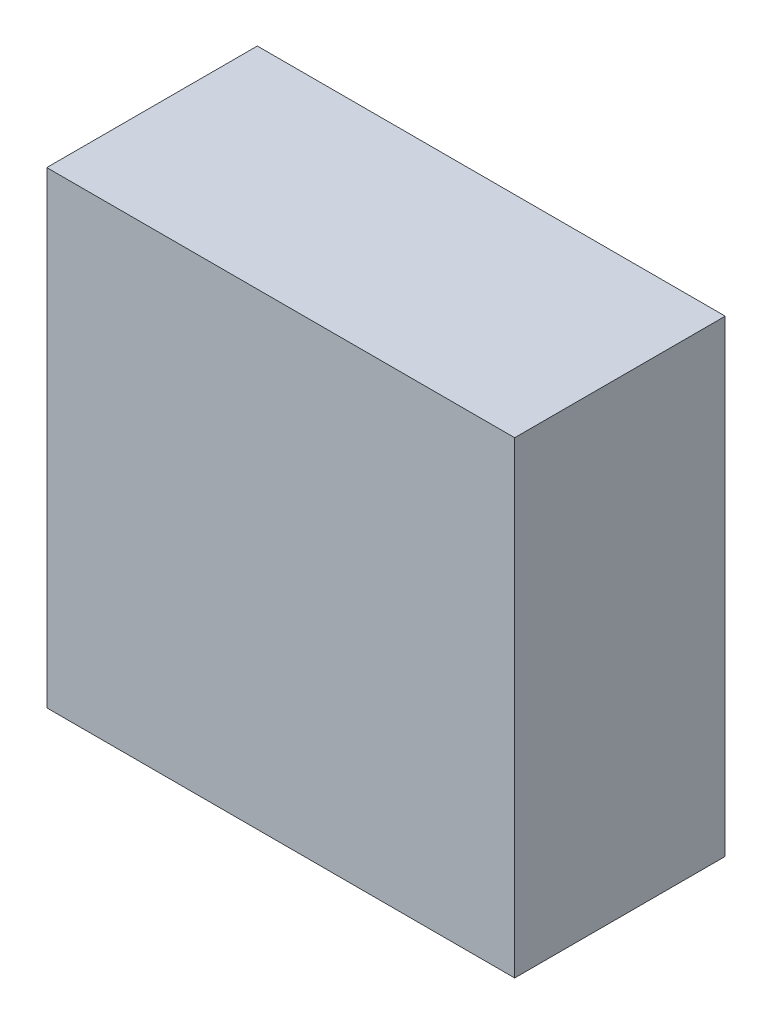
ISO-10303-21;
HEADER;
FILE_DESCRIPTION(('STEP AP214'),'2;1');
FILE_NAME('part.step','',(''),(''),'','','');
FILE_SCHEMA(('AUTOMOTIVE_DESIGN { 1 0 10303 214 1 1 1 1 }'));
ENDSEC;
DATA;
#1=APPLICATION_CONTEXT('core data for automotive mechanical design processes');
#2=APPLICATION_PROTOCOL_DEFINITION('international standard','automotive_design',2000,#1);
#3=PRODUCT_CONTEXT('',#1,'mechanical');
#4=PRODUCT('Part','Part','',(#3));
#5=PRODUCT_RELATED_PRODUCT_CATEGORY('part','',(#4));
#6=PRODUCT_DEFINITION_FORMATION('','',#4);
#7=PRODUCT_DEFINITION_CONTEXT('part definition',#1,'design');
#8=PRODUCT_DEFINITION('design','',#6,#7);
#9=PRODUCT_DEFINITION_SHAPE('','',#8);
#10=(LENGTH_UNIT() NAMED_UNIT(*) SI_UNIT(.MILLI.,.METRE.));
#11=(NAMED_UNIT(*) PLANE_ANGLE_UNIT() SI_UNIT($,.RADIAN.));
#12=(NAMED_UNIT(*) SI_UNIT($,.STERADIAN.) SOLID_ANGLE_UNIT());
#13=UNCERTAINTY_MEASURE_WITH_UNIT(LENGTH_MEASURE(1.E-05),#10,'distance_accuracy_value','');
#14=(GEOMETRIC_REPRESENTATION_CONTEXT(3) GLOBAL_UNCERTAINTY_ASSIGNED_CONTEXT((#13)) GLOBAL_UNIT_ASSIGNED_CONTEXT((#10,
#11,#12)) REPRESENTATION_CONTEXT('',''));
#15=CARTESIAN_POINT('',(0.,0.,0.));
#16=DIRECTION('',(0.,0.,1.));
#17=DIRECTION('',(1.,0.,0.));
#18=AXIS2_PLACEMENT_3D('',#15,#16,#17);
#19=CARTESIAN_POINT('',(-5.,5.,0.));
#20=DIRECTION('',(0.,1.,0.));
#21=DIRECTION('',(1.,0.,0.));
#22=AXIS2_PLACEMENT_3D('',#19,#20,#21);
#23=PLANE('',#22);
#24=DIRECTION('',(0.,0.,1.));
#25=VECTOR('',#24,1.);
#26=CARTESIAN_POINT('',(-5.,5.,0.));
#27=LINE('',#26,#25);
#28=CARTESIAN_POINT('',(-5.,5.,0.));
#29=VERTEX_POINT('',#28);
#30=CARTESIAN_POINT('',(-5.,5.,4.5));
#31=VERTEX_POINT('',#30);
#32=EDGE_CURVE('E11',#29,#31,#27,.T.);
#33=ORIENTED_EDGE('',*,*,#32,.T.);
#34=DIRECTION('',(1.,0.,0.));
#35=VECTOR('',#34,1.);
#36=CARTESIAN_POINT('',(-5.,5.,4.5));
#37=LINE('',#36,#35);
#38=CARTESIAN_POINT('',(5.,5.,4.5));
#39=VERTEX_POINT('',#38);
#40=EDGE_CURVE('E23',#31,#39,#37,.T.);
#41=ORIENTED_EDGE('',*,*,#40,.T.);
#42=DIRECTION('',(0.,0.,1.));
#43=VECTOR('',#42,1.);
#44=CARTESIAN_POINT('',(5.,5.,0.));
#45=LINE('',#44,#43);
#46=CARTESIAN_POINT('',(5.,5.,0.));
#47=VERTEX_POINT('',#46);
#48=EDGE_CURVE('E84',#47,#39,#45,.T.);
#49=ORIENTED_EDGE('',*,*,#48,.F.);
#50=DIRECTION('',(1.,0.,0.));
#51=VECTOR('',#50,1.);
#52=CARTESIAN_POINT('',(-5.,5.,0.));
#53=LINE('',#52,#51);
#54=EDGE_CURVE('E82',#29,#47,#53,.T.);
#55=ORIENTED_EDGE('',*,*,#54,.F.);
#56=EDGE_LOOP('',(#33,#41,#49,#55));
#57=FACE_BOUND('',#56,.T.);
#58=ADVANCED_FACE('F16',(#57),#23,.T.);
#59=CARTESIAN_POINT('',(5.,5.,0.));
#60=DIRECTION('',(1.,0.,0.));
#61=DIRECTION('',(0.,-1.,0.));
#62=AXIS2_PLACEMENT_3D('',#59,#60,#61);
#63=PLANE('',#62);
#64=ORIENTED_EDGE('',*,*,#48,.T.);
#65=DIRECTION('',(0.,-1.,0.));
#66=VECTOR('',#65,1.);
#67=CARTESIAN_POINT('',(5.,5.,4.5));
#68=LINE('',#67,#66);
#69=CARTESIAN_POINT('',(5.,-5.,4.5));
#70=VERTEX_POINT('',#69);
#71=EDGE_CURVE('E80',#39,#70,#68,.T.);
#72=ORIENTED_EDGE('',*,*,#71,.T.);
#73=DIRECTION('',(0.,0.,1.));
#74=VECTOR('',#73,1.);
#75=CARTESIAN_POINT('',(5.,-5.,0.));
#76=LINE('',#75,#74);
#77=CARTESIAN_POINT('',(5.,-5.,0.));
#78=VERTEX_POINT('',#77);
#79=EDGE_CURVE('E78',#78,#70,#76,.T.);
#80=ORIENTED_EDGE('',*,*,#79,.F.);
#81=DIRECTION('',(0.,-1.,0.));
#82=VECTOR('',#81,1.);
#83=CARTESIAN_POINT('',(5.,5.,0.));
#84=LINE('',#83,#82);
#85=EDGE_CURVE('E69',#47,#78,#84,.T.);
#86=ORIENTED_EDGE('',*,*,#85,.F.);
#87=EDGE_LOOP('',(#64,#72,#80,#86));
#88=FACE_BOUND('',#87,.T.);
#89=ADVANCED_FACE('F89',(#88),#63,.T.);
#90=CARTESIAN_POINT('',(5.,-5.,0.));
#91=DIRECTION('',(0.,-1.,0.));
#92=DIRECTION('',(-1.,0.,0.));
#93=AXIS2_PLACEMENT_3D('',#90,#91,#92);
#94=PLANE('',#93);
#95=ORIENTED_EDGE('',*,*,#79,.T.);
#96=DIRECTION('',(-1.,0.,0.));
#97=VECTOR('',#96,1.);
#98=CARTESIAN_POINT('',(5.,-5.,4.5));
#99=LINE('',#98,#97);
#100=CARTESIAN_POINT('',(-5.,-5.,4.5));
#101=VERTEX_POINT('',#100);
#102=EDGE_CURVE('E59',#70,#101,#99,.T.);
#103=ORIENTED_EDGE('',*,*,#102,.T.);
#104=DIRECTION('',(0.,0.,1.));
#105=VECTOR('',#104,1.);
#106=CARTESIAN_POINT('',(-5.,-5.,0.));
#107=LINE('',#106,#105);
#108=CARTESIAN_POINT('',(-5.,-5.,0.));
#109=VERTEX_POINT('',#108);
#110=EDGE_CURVE('E53',#109,#101,#107,.T.);
#111=ORIENTED_EDGE('',*,*,#110,.F.);
#112=DIRECTION('',(-1.,0.,0.));
#113=VECTOR('',#112,1.);
#114=CARTESIAN_POINT('',(5.,-5.,0.));
#115=LINE('',#114,#113);
#116=EDGE_CURVE('E57',#78,#109,#115,.T.);
#117=ORIENTED_EDGE('',*,*,#116,.F.);
#118=EDGE_LOOP('',(#95,#103,#111,#117));
#119=FACE_BOUND('',#118,.T.);
#120=ADVANCED_FACE('F56',(#119),#94,.T.);
#121=CARTESIAN_POINT('',(-5.,-5.,0.));
#122=DIRECTION('',(-1.,0.,0.));
#123=DIRECTION('',(0.,1.,0.));
#124=AXIS2_PLACEMENT_3D('',#121,#122,#123);
#125=PLANE('',#124);
#126=ORIENTED_EDGE('',*,*,#110,.T.);
#127=DIRECTION('',(0.,1.,0.));
#128=VECTOR('',#127,1.);
#129=CARTESIAN_POINT('',(-5.,-5.,4.5));
#130=LINE('',#129,#128);
#131=EDGE_CURVE('E70',#101,#31,#130,.T.);
#132=ORIENTED_EDGE('',*,*,#131,.T.);
#133=ORIENTED_EDGE('',*,*,#32,.F.);
#134=DIRECTION('',(0.,1.,0.));
#135=VECTOR('',#134,1.);
#136=CARTESIAN_POINT('',(-5.,-5.,0.));
#137=LINE('',#136,#135);
#138=EDGE_CURVE('E67',#109,#29,#137,.T.);
#139=ORIENTED_EDGE('',*,*,#138,.F.);
#140=EDGE_LOOP('',(#126,#132,#133,#139));
#141=FACE_BOUND('',#140,.T.);
#142=ADVANCED_FACE('F72',(#141),#125,.T.);
#143=CARTESIAN_POINT('',(0.,0.,0.));
#144=DIRECTION('',(0.,0.,-1.));
#145=DIRECTION('',(-1.,0.,0.));
#146=AXIS2_PLACEMENT_3D('',#143,#144,#145);
#147=PLANE('',#146);
#148=ORIENTED_EDGE('',*,*,#54,.T.);
#149=ORIENTED_EDGE('',*,*,#85,.T.);
#150=ORIENTED_EDGE('',*,*,#116,.T.);
#151=ORIENTED_EDGE('',*,*,#138,.T.);
#152=EDGE_LOOP('',(#148,#149,#150,#151));
#153=FACE_BOUND('',#152,.T.);
#154=ADVANCED_FACE('F66',(#153),#147,.T.);
#155=CARTESIAN_POINT('',(0.,0.,4.5));
#156=DIRECTION('',(0.,0.,-1.));
#157=DIRECTION('',(-1.,0.,0.));
#158=AXIS2_PLACEMENT_3D('',#155,#156,#157);
#159=PLANE('',#158);
#160=ORIENTED_EDGE('',*,*,#131,.F.);
#161=ORIENTED_EDGE('',*,*,#102,.F.);
#162=ORIENTED_EDGE('',*,*,#71,.F.);
#163=ORIENTED_EDGE('',*,*,#40,.F.);
#164=EDGE_LOOP('',(#160,#161,#162,#163));
#165=FACE_BOUND('',#164,.T.);
#166=ADVANCED_FACE('F90',(#165),#159,.F.);
#167=CLOSED_SHELL('',(#58,#89,#120,#142,#154,#166));
#168=MANIFOLD_SOLID_BREP('B1',#167);
#169=ADVANCED_BREP_SHAPE_REPRESENTATION('',(#18,#168),#14);
#170=SHAPE_DEFINITION_REPRESENTATION(#9,#169);
ENDSEC;
END-ISO-10303-21;
